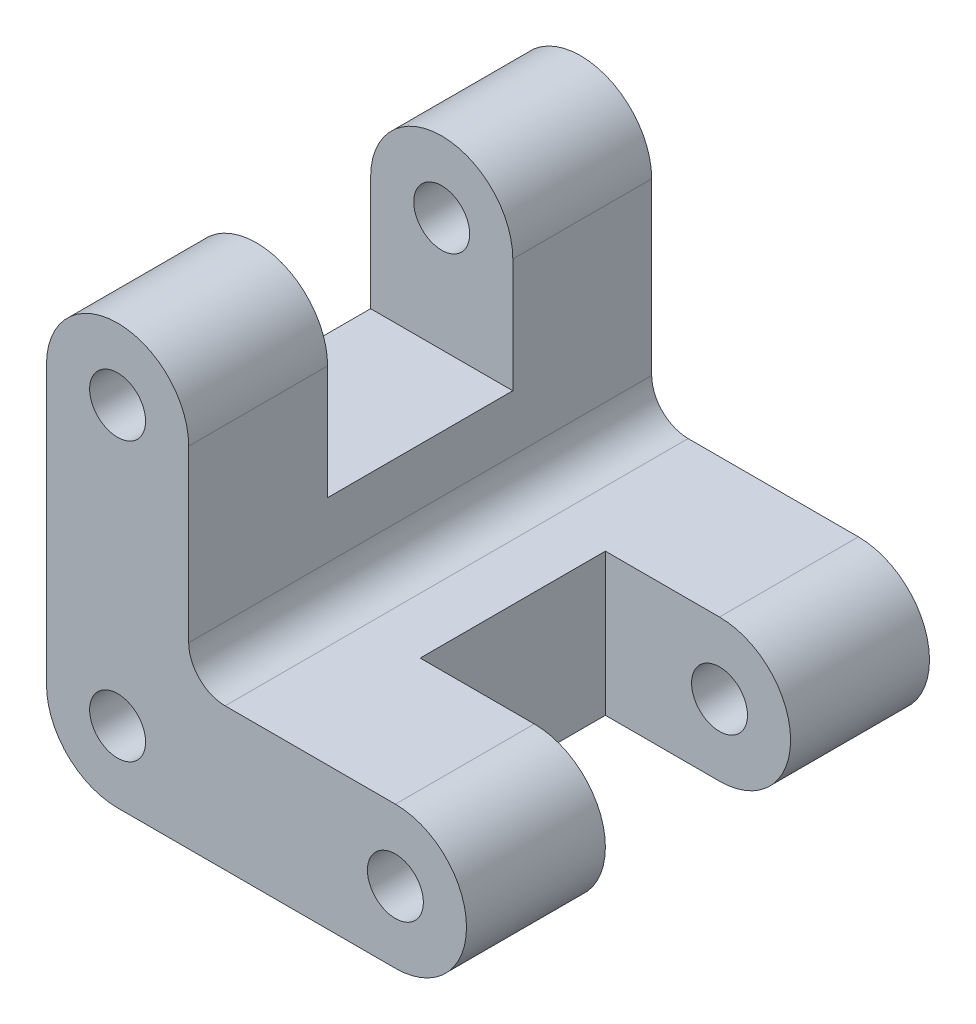
ISO-10303-21;
HEADER;
FILE_DESCRIPTION(('STEP AP214'),'2;1');
FILE_NAME('part.step','',(''),(''),'','','');
FILE_SCHEMA(('AUTOMOTIVE_DESIGN { 1 0 10303 214 1 1 1 1 }'));
ENDSEC;
DATA;
#1=APPLICATION_CONTEXT('core data for automotive mechanical design processes');
#2=APPLICATION_PROTOCOL_DEFINITION('international standard','automotive_design',2000,#1);
#3=PRODUCT_CONTEXT('',#1,'mechanical');
#4=PRODUCT('Part','Part','',(#3));
#5=PRODUCT_RELATED_PRODUCT_CATEGORY('part','',(#4));
#6=PRODUCT_DEFINITION_FORMATION('','',#4);
#7=PRODUCT_DEFINITION_CONTEXT('part definition',#1,'design');
#8=PRODUCT_DEFINITION('design','',#6,#7);
#9=PRODUCT_DEFINITION_SHAPE('','',#8);
#10=(LENGTH_UNIT() NAMED_UNIT(*) SI_UNIT(.MILLI.,.METRE.));
#11=(NAMED_UNIT(*) PLANE_ANGLE_UNIT() SI_UNIT($,.RADIAN.));
#12=(NAMED_UNIT(*) SI_UNIT($,.STERADIAN.) SOLID_ANGLE_UNIT());
#13=UNCERTAINTY_MEASURE_WITH_UNIT(LENGTH_MEASURE(1.E-05),#10,'distance_accuracy_value','');
#14=(GEOMETRIC_REPRESENTATION_CONTEXT(3) GLOBAL_UNCERTAINTY_ASSIGNED_CONTEXT((#13)) GLOBAL_UNIT_ASSIGNED_CONTEXT((#10,
#11,#12)) REPRESENTATION_CONTEXT('',''));
#15=CARTESIAN_POINT('',(0.,0.,0.));
#16=DIRECTION('',(0.,0.,1.));
#17=DIRECTION('',(1.,0.,0.));
#18=AXIS2_PLACEMENT_3D('',#15,#16,#17);
#19=CARTESIAN_POINT('',(0.,-19.5,127.));
#20=DIRECTION('',(0.,1.,0.));
#21=DIRECTION('',(-1.,0.,0.));
#22=AXIS2_PLACEMENT_3D('',#19,#20,#21);
#23=PLANE('',#22);
#24=DIRECTION('',(1.,0.,0.));
#25=VECTOR('',#24,1.);
#26=CARTESIAN_POINT('',(115.645219222053,-19.4999999999998,38.1));
#27=LINE('',#26,#25);
#28=CARTESIAN_POINT('',(44.9000000000002,-19.5000000000005,38.1));
#29=VERTEX_POINT('',#28);
#30=CARTESIAN_POINT('',(76.2000000000002,-19.5000000000002,38.1));
#31=VERTEX_POINT('',#30);
#32=EDGE_CURVE('E152',#29,#31,#27,.T.);
#33=ORIENTED_EDGE('',*,*,#32,.F.);
#34=DIRECTION('',(0.,0.,-1.));
#35=VECTOR('',#34,1.);
#36=CARTESIAN_POINT('',(44.9000000000002,-19.5000000000005,38.1));
#37=LINE('',#36,#35);
#38=CARTESIAN_POINT('',(44.9000000000002,-19.5000000000005,88.9));
#39=VERTEX_POINT('',#38);
#40=EDGE_CURVE('E144',#39,#29,#37,.T.);
#41=ORIENTED_EDGE('',*,*,#40,.F.);
#42=DIRECTION('',(-1.,0.,0.));
#43=VECTOR('',#42,1.);
#44=CARTESIAN_POINT('',(115.645219222053,-19.4999999999998,88.9));
#45=LINE('',#44,#43);
#46=CARTESIAN_POINT('',(76.2000000000002,-19.5000000000002,88.9));
#47=VERTEX_POINT('',#46);
#48=EDGE_CURVE('E151',#47,#39,#45,.T.);
#49=ORIENTED_EDGE('',*,*,#48,.F.);
#50=DIRECTION('',(0.,0.,-1.));
#51=VECTOR('',#50,1.);
#52=CARTESIAN_POINT('',(76.2,-19.5,127.));
#53=LINE('',#52,#51);
#54=CARTESIAN_POINT('',(76.2,-19.5,127.));
#55=VERTEX_POINT('',#54);
#56=EDGE_CURVE('E263',#55,#47,#53,.T.);
#57=ORIENTED_EDGE('',*,*,#56,.F.);
#58=DIRECTION('',(1.,0.,0.));
#59=VECTOR('',#58,1.);
#60=CARTESIAN_POINT('',(0.,-19.5,127.));
#61=LINE('',#60,#59);
#62=CARTESIAN_POINT('',(0.,-19.5,127.));
#63=VERTEX_POINT('',#62);
#64=EDGE_CURVE('E230',#63,#55,#61,.T.);
#65=ORIENTED_EDGE('',*,*,#64,.F.);
#66=DIRECTION('',(0.,0.,-1.));
#67=VECTOR('',#66,1.);
#68=CARTESIAN_POINT('',(0.,-19.5,127.));
#69=LINE('',#68,#67);
#70=CARTESIAN_POINT('',(0.,-19.5,0.));
#71=VERTEX_POINT('',#70);
#72=EDGE_CURVE('E266',#63,#71,#69,.T.);
#73=ORIENTED_EDGE('',*,*,#72,.T.);
#74=DIRECTION('',(1.,0.,0.));
#75=VECTOR('',#74,1.);
#76=CARTESIAN_POINT('',(0.,-19.5,0.));
#77=LINE('',#76,#75);
#78=CARTESIAN_POINT('',(76.2,-19.5,0.));
#79=VERTEX_POINT('',#78);
#80=EDGE_CURVE('E246',#71,#79,#77,.T.);
#81=ORIENTED_EDGE('',*,*,#80,.T.);
#82=EDGE_CURVE('E163',#31,#79,#53,.T.);
#83=ORIENTED_EDGE('',*,*,#82,.F.);
#84=EDGE_LOOP('',(#33,#41,#49,#57,#65,#73,#81,#83));
#85=FACE_BOUND('',#84,.T.);
#86=ADVANCED_FACE('F33',(#85),#23,.F.);
#87=CARTESIAN_POINT('',(76.2,0.,127.));
#88=DIRECTION('',(0.,0.,-1.));
#89=DIRECTION('',(-1.,0.,0.));
#90=AXIS2_PLACEMENT_3D('',#87,#88,#89);
#91=CYLINDRICAL_SURFACE('',#90,19.5);
#92=CARTESIAN_POINT('',(76.2,0.,38.1));
#93=DIRECTION('',(0.,0.,1.));
#94=DIRECTION('',(1.,0.,0.));
#95=AXIS2_PLACEMENT_3D('',#92,#93,#94);
#96=CIRCLE('',#95,19.5);
#97=CARTESIAN_POINT('',(76.2,19.5,38.1));
#98=VERTEX_POINT('',#97);
#99=EDGE_CURVE('E175',#31,#98,#96,.T.);
#100=ORIENTED_EDGE('',*,*,#99,.F.);
#101=ORIENTED_EDGE('',*,*,#82,.T.);
#102=CARTESIAN_POINT('',(76.2,0.,0.));
#103=DIRECTION('',(0.,0.,1.));
#104=DIRECTION('',(1.,0.,0.));
#105=AXIS2_PLACEMENT_3D('',#102,#103,#104);
#106=CIRCLE('',#105,19.5);
#107=CARTESIAN_POINT('',(76.2,19.5,0.));
#108=VERTEX_POINT('',#107);
#109=EDGE_CURVE('E248',#79,#108,#106,.T.);
#110=ORIENTED_EDGE('',*,*,#109,.T.);
#111=DIRECTION('',(0.,0.,-1.));
#112=VECTOR('',#111,1.);
#113=CARTESIAN_POINT('',(76.2,19.5,127.));
#114=LINE('',#113,#112);
#115=EDGE_CURVE('E259',#98,#108,#114,.T.);
#116=ORIENTED_EDGE('',*,*,#115,.F.);
#117=EDGE_LOOP('',(#100,#101,#110,#116));
#118=FACE_BOUND('',#117,.T.);
#119=ADVANCED_FACE('F310',(#118),#91,.T.);
#120=CARTESIAN_POINT('',(76.2,0.,88.9));
#121=DIRECTION('',(0.,0.,-1.));
#122=DIRECTION('',(-1.,0.,0.));
#123=AXIS2_PLACEMENT_3D('',#120,#121,#122);
#124=CIRCLE('',#123,19.5);
#125=CARTESIAN_POINT('',(76.2,19.5,88.9));
#126=VERTEX_POINT('',#125);
#127=EDGE_CURVE('E171',#126,#47,#124,.T.);
#128=ORIENTED_EDGE('',*,*,#127,.F.);
#129=CARTESIAN_POINT('',(76.2,19.5,127.));
#130=VERTEX_POINT('',#129);
#131=EDGE_CURVE('E260',#130,#126,#114,.T.);
#132=ORIENTED_EDGE('',*,*,#131,.F.);
#133=CARTESIAN_POINT('',(76.2,0.,127.));
#134=DIRECTION('',(0.,0.,1.));
#135=DIRECTION('',(1.,0.,0.));
#136=AXIS2_PLACEMENT_3D('',#133,#134,#135);
#137=CIRCLE('',#136,19.5);
#138=EDGE_CURVE('E232',#55,#130,#137,.T.);
#139=ORIENTED_EDGE('',*,*,#138,.F.);
#140=ORIENTED_EDGE('',*,*,#56,.T.);
#141=EDGE_LOOP('',(#128,#132,#139,#140));
#142=FACE_BOUND('',#141,.T.);
#143=ADVANCED_FACE('F316',(#142),#91,.T.);
#144=CARTESIAN_POINT('',(19.5,19.5,127.));
#145=DIRECTION('',(0.,-1.,0.));
#146=DIRECTION('',(1.,0.,0.));
#147=AXIS2_PLACEMENT_3D('',#144,#145,#146);
#148=PLANE('',#147);
#149=DIRECTION('',(-1.,0.,0.));
#150=VECTOR('',#149,1.);
#151=CARTESIAN_POINT('',(19.5,19.5,38.1));
#152=LINE('',#151,#150);
#153=CARTESIAN_POINT('',(44.8999999999998,19.5,38.1));
#154=VERTEX_POINT('',#153);
#155=EDGE_CURVE('E158',#98,#154,#152,.T.);
#156=ORIENTED_EDGE('',*,*,#155,.F.);
#157=ORIENTED_EDGE('',*,*,#115,.T.);
#158=DIRECTION('',(-1.,0.,0.));
#159=VECTOR('',#158,1.);
#160=CARTESIAN_POINT('',(19.5,19.5,0.));
#161=LINE('',#160,#159);
#162=CARTESIAN_POINT('',(29.5,19.5,0.));
#163=VERTEX_POINT('',#162);
#164=EDGE_CURVE('E251',#108,#163,#161,.T.);
#165=ORIENTED_EDGE('',*,*,#164,.T.);
#166=DIRECTION('',(0.,0.,-1.));
#167=VECTOR('',#166,1.);
#168=CARTESIAN_POINT('',(29.5,19.5,127.));
#169=LINE('',#168,#167);
#170=CARTESIAN_POINT('',(29.5,19.5,127.));
#171=VERTEX_POINT('',#170);
#172=EDGE_CURVE('E279',#163,#171,#169,.F.);
#173=ORIENTED_EDGE('',*,*,#172,.T.);
#174=DIRECTION('',(-1.,0.,0.));
#175=VECTOR('',#174,1.);
#176=CARTESIAN_POINT('',(19.5,19.5,127.));
#177=LINE('',#176,#175);
#178=EDGE_CURVE('E234',#130,#171,#177,.T.);
#179=ORIENTED_EDGE('',*,*,#178,.F.);
#180=ORIENTED_EDGE('',*,*,#131,.T.);
#181=DIRECTION('',(1.,0.,0.));
#182=VECTOR('',#181,1.);
#183=CARTESIAN_POINT('',(19.5,19.5,88.9));
#184=LINE('',#183,#182);
#185=CARTESIAN_POINT('',(44.8999999999998,19.5,88.9));
#186=VERTEX_POINT('',#185);
#187=EDGE_CURVE('E169',#186,#126,#184,.T.);
#188=ORIENTED_EDGE('',*,*,#187,.F.);
#189=DIRECTION('',(0.,0.,1.));
#190=VECTOR('',#189,1.);
#191=CARTESIAN_POINT('',(44.8999999999998,19.5,127.));
#192=LINE('',#191,#190);
#193=EDGE_CURVE('E11',#154,#186,#192,.T.);
#194=ORIENTED_EDGE('',*,*,#193,.F.);
#195=EDGE_LOOP('',(#156,#157,#165,#173,#179,#180,#188,#194));
#196=FACE_BOUND('',#195,.T.);
#197=ADVANCED_FACE('F389',(#196),#148,.F.);
#198=CARTESIAN_POINT('',(76.2,0.,127.));
#199=DIRECTION('',(0.,0.,-1.));
#200=DIRECTION('',(-1.,0.,0.));
#201=AXIS2_PLACEMENT_3D('',#198,#199,#200);
#202=CYLINDRICAL_SURFACE('',#201,7.67);
#203=CARTESIAN_POINT('',(76.2,0.,0.));
#204=DIRECTION('',(0.,0.,1.));
#205=DIRECTION('',(1.,0.,0.));
#206=AXIS2_PLACEMENT_3D('',#203,#204,#205);
#207=CIRCLE('',#206,7.67);
#208=CARTESIAN_POINT('',(83.87,0.,0.));
#209=VERTEX_POINT('',#208);
#210=EDGE_CURVE('E203',#209,#209,#207,.T.);
#211=ORIENTED_EDGE('',*,*,#210,.F.);
#212=EDGE_LOOP('',(#211));
#213=FACE_BOUND('',#212,.T.);
#214=CARTESIAN_POINT('',(76.2,0.,38.1));
#215=DIRECTION('',(0.,0.,1.));
#216=DIRECTION('',(1.,0.,0.));
#217=AXIS2_PLACEMENT_3D('',#214,#215,#216);
#218=CIRCLE('',#217,7.67);
#219=CARTESIAN_POINT('',(83.87,0.,38.1));
#220=VERTEX_POINT('',#219);
#221=EDGE_CURVE('E173',#220,#220,#218,.T.);
#222=ORIENTED_EDGE('',*,*,#221,.T.);
#223=EDGE_LOOP('',(#222));
#224=FACE_BOUND('',#223,.T.);
#225=ADVANCED_FACE('F295',(#213,#224),#202,.F.);
#226=CARTESIAN_POINT('',(76.2,0.,127.));
#227=DIRECTION('',(0.,0.,1.));
#228=DIRECTION('',(1.,0.,0.));
#229=AXIS2_PLACEMENT_3D('',#226,#227,#228);
#230=CIRCLE('',#229,7.67);
#231=CARTESIAN_POINT('',(83.87,0.,127.));
#232=VERTEX_POINT('',#231);
#233=EDGE_CURVE('E204',#232,#232,#230,.T.);
#234=ORIENTED_EDGE('',*,*,#233,.T.);
#235=EDGE_LOOP('',(#234));
#236=FACE_BOUND('',#235,.T.);
#237=CARTESIAN_POINT('',(76.2,0.,88.9));
#238=DIRECTION('',(0.,0.,-1.));
#239=DIRECTION('',(-1.,0.,0.));
#240=AXIS2_PLACEMENT_3D('',#237,#238,#239);
#241=CIRCLE('',#240,7.67);
#242=CARTESIAN_POINT('',(68.53,0.,88.9));
#243=VERTEX_POINT('',#242);
#244=EDGE_CURVE('E167',#243,#243,#241,.T.);
#245=ORIENTED_EDGE('',*,*,#244,.T.);
#246=EDGE_LOOP('',(#245));
#247=FACE_BOUND('',#246,.T.);
#248=ADVANCED_FACE('F343',(#236,#247),#202,.F.);
#249=CARTESIAN_POINT('',(0.,76.2,127.));
#250=DIRECTION('',(0.,0.,-1.));
#251=DIRECTION('',(-1.,0.,0.));
#252=AXIS2_PLACEMENT_3D('',#249,#250,#251);
#253=CYLINDRICAL_SURFACE('',#252,19.5);
#254=DIRECTION('',(0.,0.,-1.));
#255=VECTOR('',#254,1.);
#256=CARTESIAN_POINT('',(-19.5,76.2,127.));
#257=LINE('',#256,#255);
#258=CARTESIAN_POINT('',(-19.5,76.2,38.1));
#259=VERTEX_POINT('',#258);
#260=CARTESIAN_POINT('',(-19.5,76.2,0.));
#261=VERTEX_POINT('',#260);
#262=EDGE_CURVE('E272',#259,#261,#257,.T.);
#263=ORIENTED_EDGE('',*,*,#262,.F.);
#264=CARTESIAN_POINT('',(0.,76.2,38.1));
#265=DIRECTION('',(0.,0.,-1.));
#266=DIRECTION('',(0.,1.,0.));
#267=AXIS2_PLACEMENT_3D('',#264,#265,#266);
#268=CIRCLE('',#267,19.5);
#269=CARTESIAN_POINT('',(19.5,76.2,38.1));
#270=VERTEX_POINT('',#269);
#271=EDGE_CURVE('E200',#259,#270,#268,.T.);
#272=ORIENTED_EDGE('',*,*,#271,.T.);
#273=DIRECTION('',(0.,0.,-1.));
#274=VECTOR('',#273,1.);
#275=CARTESIAN_POINT('',(19.5,76.2,127.));
#276=LINE('',#275,#274);
#277=CARTESIAN_POINT('',(19.5,76.2,0.));
#278=VERTEX_POINT('',#277);
#279=EDGE_CURVE('E239',#270,#278,#276,.T.);
#280=ORIENTED_EDGE('',*,*,#279,.T.);
#281=CARTESIAN_POINT('',(0.,76.2,0.));
#282=DIRECTION('',(0.,0.,1.));
#283=DIRECTION('',(-1.,0.,0.));
#284=AXIS2_PLACEMENT_3D('',#281,#282,#283);
#285=CIRCLE('',#284,19.5);
#286=EDGE_CURVE('E219',#278,#261,#285,.T.);
#287=ORIENTED_EDGE('',*,*,#286,.T.);
#288=EDGE_LOOP('',(#263,#272,#280,#287));
#289=FACE_BOUND('',#288,.T.);
#290=ADVANCED_FACE('F333',(#289),#253,.T.);
#291=CARTESIAN_POINT('',(0.,76.2,127.));
#292=DIRECTION('',(0.,0.,-1.));
#293=DIRECTION('',(-1.,0.,0.));
#294=AXIS2_PLACEMENT_3D('',#291,#292,#293);
#295=CYLINDRICAL_SURFACE('',#294,7.67);
#296=CARTESIAN_POINT('',(0.,76.2,38.1));
#297=DIRECTION('',(0.,0.,-1.));
#298=DIRECTION('',(0.,1.,0.));
#299=AXIS2_PLACEMENT_3D('',#296,#297,#298);
#300=CIRCLE('',#299,7.67);
#301=CARTESIAN_POINT('',(0.,83.87,38.1));
#302=VERTEX_POINT('',#301);
#303=EDGE_CURVE('E196',#302,#302,#300,.T.);
#304=ORIENTED_EDGE('',*,*,#303,.F.);
#305=EDGE_LOOP('',(#304));
#306=FACE_BOUND('',#305,.T.);
#307=CARTESIAN_POINT('',(0.,76.2,0.));
#308=DIRECTION('',(0.,0.,1.));
#309=DIRECTION('',(1.,0.,0.));
#310=AXIS2_PLACEMENT_3D('',#307,#308,#309);
#311=CIRCLE('',#310,7.67);
#312=CARTESIAN_POINT('',(7.67,76.2,0.));
#313=VERTEX_POINT('',#312);
#314=EDGE_CURVE('E207',#313,#313,#311,.T.);
#315=ORIENTED_EDGE('',*,*,#314,.F.);
#316=EDGE_LOOP('',(#315));
#317=FACE_BOUND('',#316,.T.);
#318=ADVANCED_FACE('F342',(#306,#317),#295,.F.);
#319=CARTESIAN_POINT('',(0.,76.2,127.));
#320=DIRECTION('',(0.,0.,-1.));
#321=DIRECTION('',(-1.,0.,0.));
#322=AXIS2_PLACEMENT_3D('',#319,#320,#321);
#323=PLANE('',#322);
#324=CARTESIAN_POINT('',(0.,76.2,127.));
#325=DIRECTION('',(0.,0.,1.));
#326=DIRECTION('',(-1.,0.,0.));
#327=AXIS2_PLACEMENT_3D('',#324,#325,#326);
#328=CIRCLE('',#327,19.5);
#329=CARTESIAN_POINT('',(19.5,76.2,127.));
#330=VERTEX_POINT('',#329);
#331=CARTESIAN_POINT('',(-19.5,76.2,127.));
#332=VERTEX_POINT('',#331);
#333=EDGE_CURVE('E222',#330,#332,#328,.T.);
#334=ORIENTED_EDGE('',*,*,#333,.T.);
#335=DIRECTION('',(0.,-1.,0.));
#336=VECTOR('',#335,1.);
#337=CARTESIAN_POINT('',(-19.5,76.2,127.));
#338=LINE('',#337,#336);
#339=CARTESIAN_POINT('',(-19.5,0.,127.));
#340=VERTEX_POINT('',#339);
#341=EDGE_CURVE('E225',#332,#340,#338,.T.);
#342=ORIENTED_EDGE('',*,*,#341,.T.);
#343=CARTESIAN_POINT('',(0.,0.,127.));
#344=DIRECTION('',(0.,0.,1.));
#345=DIRECTION('',(1.,0.,0.));
#346=AXIS2_PLACEMENT_3D('',#343,#344,#345);
#347=CIRCLE('',#346,19.5);
#348=EDGE_CURVE('E228',#340,#63,#347,.T.);
#349=ORIENTED_EDGE('',*,*,#348,.T.);
#350=ORIENTED_EDGE('',*,*,#64,.T.);
#351=ORIENTED_EDGE('',*,*,#138,.T.);
#352=ORIENTED_EDGE('',*,*,#178,.T.);
#353=CARTESIAN_POINT('',(29.5,29.5,127.));
#354=DIRECTION('',(0.,0.,-1.));
#355=DIRECTION('',(-1.,0.,0.));
#356=AXIS2_PLACEMENT_3D('',#353,#354,#355);
#357=CIRCLE('',#356,10.);
#358=CARTESIAN_POINT('',(19.5,29.5,127.));
#359=VERTEX_POINT('',#358);
#360=EDGE_CURVE('E283',#171,#359,#357,.T.);
#361=ORIENTED_EDGE('',*,*,#360,.T.);
#362=DIRECTION('',(0.,1.,0.));
#363=VECTOR('',#362,1.);
#364=CARTESIAN_POINT('',(19.5,76.2,127.));
#365=LINE('',#364,#363);
#366=EDGE_CURVE('E237',#359,#330,#365,.T.);
#367=ORIENTED_EDGE('',*,*,#366,.T.);
#368=EDGE_LOOP('',(#334,#342,#349,#350,#351,#352,#361,#367));
#369=FACE_BOUND('',#368,.T.);
#370=CARTESIAN_POINT('',(0.,0.,127.));
#371=DIRECTION('',(0.,0.,1.));
#372=DIRECTION('',(1.,0.,0.));
#373=AXIS2_PLACEMENT_3D('',#370,#371,#372);
#374=CIRCLE('',#373,7.67);
#375=CARTESIAN_POINT('',(7.67,0.,127.));
#376=VERTEX_POINT('',#375);
#377=EDGE_CURVE('E216',#376,#376,#374,.T.);
#378=ORIENTED_EDGE('',*,*,#377,.F.);
#379=EDGE_LOOP('',(#378));
#380=FACE_BOUND('',#379,.T.);
#381=CARTESIAN_POINT('',(0.,76.2,127.));
#382=DIRECTION('',(0.,0.,1.));
#383=DIRECTION('',(1.,0.,0.));
#384=AXIS2_PLACEMENT_3D('',#381,#382,#383);
#385=CIRCLE('',#384,7.67);
#386=CARTESIAN_POINT('',(7.67,76.2,127.));
#387=VERTEX_POINT('',#386);
#388=EDGE_CURVE('E210',#387,#387,#385,.T.);
#389=ORIENTED_EDGE('',*,*,#388,.F.);
#390=EDGE_LOOP('',(#389));
#391=FACE_BOUND('',#390,.T.);
#392=ORIENTED_EDGE('',*,*,#233,.F.);
#393=EDGE_LOOP('',(#392));
#394=FACE_BOUND('',#393,.T.);
#395=ADVANCED_FACE('F338',(#369,#380,#391,#394),#323,.F.);
#396=CARTESIAN_POINT('',(0.,76.2,0.));
#397=DIRECTION('',(0.,0.,-1.));
#398=DIRECTION('',(-1.,0.,0.));
#399=AXIS2_PLACEMENT_3D('',#396,#397,#398);
#400=PLANE('',#399);
#401=ORIENTED_EDGE('',*,*,#314,.T.);
#402=EDGE_LOOP('',(#401));
#403=FACE_BOUND('',#402,.T.);
#404=ORIENTED_EDGE('',*,*,#286,.F.);
#405=DIRECTION('',(0.,1.,0.));
#406=VECTOR('',#405,1.);
#407=CARTESIAN_POINT('',(19.5,76.2,0.));
#408=LINE('',#407,#406);
#409=CARTESIAN_POINT('',(19.5,29.5,0.));
#410=VERTEX_POINT('',#409);
#411=EDGE_CURVE('E226',#410,#278,#408,.T.);
#412=ORIENTED_EDGE('',*,*,#411,.F.);
#413=CARTESIAN_POINT('',(29.5,29.5,0.));
#414=DIRECTION('',(0.,0.,-1.));
#415=DIRECTION('',(-1.,0.,0.));
#416=AXIS2_PLACEMENT_3D('',#413,#414,#415);
#417=CIRCLE('',#416,10.);
#418=EDGE_CURVE('E281',#410,#163,#417,.F.);
#419=ORIENTED_EDGE('',*,*,#418,.T.);
#420=ORIENTED_EDGE('',*,*,#164,.F.);
#421=ORIENTED_EDGE('',*,*,#109,.F.);
#422=ORIENTED_EDGE('',*,*,#80,.F.);
#423=CARTESIAN_POINT('',(0.,0.,0.));
#424=DIRECTION('',(0.,0.,1.));
#425=DIRECTION('',(1.,0.,0.));
#426=AXIS2_PLACEMENT_3D('',#423,#424,#425);
#427=CIRCLE('',#426,19.5);
#428=CARTESIAN_POINT('',(-19.5,0.,0.));
#429=VERTEX_POINT('',#428);
#430=EDGE_CURVE('E244',#429,#71,#427,.T.);
#431=ORIENTED_EDGE('',*,*,#430,.F.);
#432=DIRECTION('',(0.,-1.,0.));
#433=VECTOR('',#432,1.);
#434=CARTESIAN_POINT('',(-19.5,76.2,0.));
#435=LINE('',#434,#433);
#436=EDGE_CURVE('E242',#261,#429,#435,.T.);
#437=ORIENTED_EDGE('',*,*,#436,.F.);
#438=EDGE_LOOP('',(#404,#412,#419,#420,#421,#422,#431,#437));
#439=FACE_BOUND('',#438,.T.);
#440=CARTESIAN_POINT('',(0.,0.,0.));
#441=DIRECTION('',(0.,0.,1.));
#442=DIRECTION('',(1.,0.,0.));
#443=AXIS2_PLACEMENT_3D('',#440,#441,#442);
#444=CIRCLE('',#443,7.67);
#445=CARTESIAN_POINT('',(7.67,0.,0.));
#446=VERTEX_POINT('',#445);
#447=EDGE_CURVE('E213',#446,#446,#444,.T.);
#448=ORIENTED_EDGE('',*,*,#447,.T.);
#449=EDGE_LOOP('',(#448));
#450=FACE_BOUND('',#449,.T.);
#451=ORIENTED_EDGE('',*,*,#210,.T.);
#452=EDGE_LOOP('',(#451));
#453=FACE_BOUND('',#452,.T.);
#454=ADVANCED_FACE('F331',(#403,#439,#450,#453),#400,.T.);
#455=CARTESIAN_POINT('',(19.5,76.2,88.9));
#456=VERTEX_POINT('',#455);
#457=EDGE_CURVE('E256',#330,#456,#276,.T.);
#458=ORIENTED_EDGE('',*,*,#457,.T.);
#459=CARTESIAN_POINT('',(0.,76.2,88.9));
#460=DIRECTION('',(0.,0.,1.));
#461=DIRECTION('',(1.,0.,0.));
#462=AXIS2_PLACEMENT_3D('',#459,#460,#461);
#463=CIRCLE('',#462,19.5);
#464=CARTESIAN_POINT('',(-19.5,76.2,88.9));
#465=VERTEX_POINT('',#464);
#466=EDGE_CURVE('E55',#456,#465,#463,.T.);
#467=ORIENTED_EDGE('',*,*,#466,.T.);
#468=EDGE_CURVE('E273',#332,#465,#257,.T.);
#469=ORIENTED_EDGE('',*,*,#468,.F.);
#470=ORIENTED_EDGE('',*,*,#333,.F.);
#471=EDGE_LOOP('',(#458,#467,#469,#470));
#472=FACE_BOUND('',#471,.T.);
#473=ADVANCED_FACE('F328',(#472),#253,.T.);
#474=CARTESIAN_POINT('',(-19.5,76.2,127.));
#475=DIRECTION('',(1.,0.,0.));
#476=DIRECTION('',(0.,1.,0.));
#477=AXIS2_PLACEMENT_3D('',#474,#475,#476);
#478=PLANE('',#477);
#479=DIRECTION('',(0.,0.,-1.));
#480=VECTOR('',#479,1.);
#481=CARTESIAN_POINT('',(-19.5,44.9,38.1));
#482=LINE('',#481,#480);
#483=CARTESIAN_POINT('',(-19.5,44.9,88.9));
#484=VERTEX_POINT('',#483);
#485=CARTESIAN_POINT('',(-19.5,44.9,38.1));
#486=VERTEX_POINT('',#485);
#487=EDGE_CURVE('E183',#484,#486,#482,.T.);
#488=ORIENTED_EDGE('',*,*,#487,.T.);
#489=DIRECTION('',(0.,1.,0.));
#490=VECTOR('',#489,1.);
#491=CARTESIAN_POINT('',(-19.5,115.645219222053,38.1));
#492=LINE('',#491,#490);
#493=EDGE_CURVE('E177',#486,#259,#492,.T.);
#494=ORIENTED_EDGE('',*,*,#493,.T.);
#495=ORIENTED_EDGE('',*,*,#262,.T.);
#496=ORIENTED_EDGE('',*,*,#436,.T.);
#497=DIRECTION('',(0.,0.,-1.));
#498=VECTOR('',#497,1.);
#499=CARTESIAN_POINT('',(-19.5,0.,127.));
#500=LINE('',#499,#498);
#501=EDGE_CURVE('E269',#340,#429,#500,.T.);
#502=ORIENTED_EDGE('',*,*,#501,.F.);
#503=ORIENTED_EDGE('',*,*,#341,.F.);
#504=ORIENTED_EDGE('',*,*,#468,.T.);
#505=DIRECTION('',(0.,-1.,0.));
#506=VECTOR('',#505,1.);
#507=CARTESIAN_POINT('',(-19.5,115.645219222053,88.9));
#508=LINE('',#507,#506);
#509=EDGE_CURVE('E180',#465,#484,#508,.T.);
#510=ORIENTED_EDGE('',*,*,#509,.T.);
#511=EDGE_LOOP('',(#488,#494,#495,#496,#502,#503,#504,#510));
#512=FACE_BOUND('',#511,.T.);
#513=ADVANCED_FACE('F325',(#512),#478,.F.);
#514=CARTESIAN_POINT('',(0.,0.,127.));
#515=DIRECTION('',(0.,0.,-1.));
#516=DIRECTION('',(-1.,0.,0.));
#517=AXIS2_PLACEMENT_3D('',#514,#515,#516);
#518=CYLINDRICAL_SURFACE('',#517,19.5);
#519=ORIENTED_EDGE('',*,*,#430,.T.);
#520=ORIENTED_EDGE('',*,*,#72,.F.);
#521=ORIENTED_EDGE('',*,*,#348,.F.);
#522=ORIENTED_EDGE('',*,*,#501,.T.);
#523=EDGE_LOOP('',(#519,#520,#521,#522));
#524=FACE_BOUND('',#523,.T.);
#525=ADVANCED_FACE('F321',(#524),#518,.T.);
#526=CARTESIAN_POINT('',(19.5,76.2,127.));
#527=DIRECTION('',(-1.,0.,0.));
#528=DIRECTION('',(0.,0.,1.));
#529=AXIS2_PLACEMENT_3D('',#526,#527,#528);
#530=PLANE('',#529);
#531=ORIENTED_EDGE('',*,*,#279,.F.);
#532=DIRECTION('',(0.,-1.,0.));
#533=VECTOR('',#532,1.);
#534=CARTESIAN_POINT('',(19.5,76.2,38.1));
#535=LINE('',#534,#533);
#536=CARTESIAN_POINT('',(19.5,44.9,38.1));
#537=VERTEX_POINT('',#536);
#538=EDGE_CURVE('E197',#270,#537,#535,.T.);
#539=ORIENTED_EDGE('',*,*,#538,.T.);
#540=DIRECTION('',(0.,0.,1.));
#541=VECTOR('',#540,1.);
#542=CARTESIAN_POINT('',(19.5,44.9,127.));
#543=LINE('',#542,#541);
#544=CARTESIAN_POINT('',(19.5,44.9,88.9));
#545=VERTEX_POINT('',#544);
#546=EDGE_CURVE('E41',#537,#545,#543,.T.);
#547=ORIENTED_EDGE('',*,*,#546,.T.);
#548=DIRECTION('',(0.,1.,0.));
#549=VECTOR('',#548,1.);
#550=CARTESIAN_POINT('',(19.5,76.2,88.9));
#551=LINE('',#550,#549);
#552=EDGE_CURVE('E193',#545,#456,#551,.T.);
#553=ORIENTED_EDGE('',*,*,#552,.T.);
#554=ORIENTED_EDGE('',*,*,#457,.F.);
#555=ORIENTED_EDGE('',*,*,#366,.F.);
#556=DIRECTION('',(0.,0.,-1.));
#557=VECTOR('',#556,1.);
#558=CARTESIAN_POINT('',(19.5,29.5,0.));
#559=LINE('',#558,#557);
#560=EDGE_CURVE('E276',#359,#410,#559,.T.);
#561=ORIENTED_EDGE('',*,*,#560,.T.);
#562=ORIENTED_EDGE('',*,*,#411,.T.);
#563=EDGE_LOOP('',(#531,#539,#547,#553,#554,#555,#561,#562));
#564=FACE_BOUND('',#563,.T.);
#565=ADVANCED_FACE('F324',(#564),#530,.F.);
#566=CARTESIAN_POINT('',(0.,0.,127.));
#567=DIRECTION('',(0.,0.,-1.));
#568=DIRECTION('',(-1.,0.,0.));
#569=AXIS2_PLACEMENT_3D('',#566,#567,#568);
#570=CYLINDRICAL_SURFACE('',#569,7.67);
#571=ORIENTED_EDGE('',*,*,#377,.T.);
#572=EDGE_LOOP('',(#571));
#573=FACE_BOUND('',#572,.T.);
#574=ORIENTED_EDGE('',*,*,#447,.F.);
#575=EDGE_LOOP('',(#574));
#576=FACE_BOUND('',#575,.T.);
#577=ADVANCED_FACE('F407',(#573,#576),#570,.F.);
#578=CARTESIAN_POINT('',(0.,76.2,88.9));
#579=DIRECTION('',(0.,0.,1.));
#580=DIRECTION('',(1.,0.,0.));
#581=AXIS2_PLACEMENT_3D('',#578,#579,#580);
#582=CIRCLE('',#581,7.67);
#583=CARTESIAN_POINT('',(7.67,76.2,88.9));
#584=VERTEX_POINT('',#583);
#585=EDGE_CURVE('E190',#584,#584,#582,.T.);
#586=ORIENTED_EDGE('',*,*,#585,.F.);
#587=EDGE_LOOP('',(#586));
#588=FACE_BOUND('',#587,.T.);
#589=ORIENTED_EDGE('',*,*,#388,.T.);
#590=EDGE_LOOP('',(#589));
#591=FACE_BOUND('',#590,.T.);
#592=ADVANCED_FACE('F350',(#588,#591),#295,.F.);
#593=CARTESIAN_POINT('',(29.5,29.5,127.));
#594=DIRECTION('',(0.,0.,1.));
#595=DIRECTION('',(1.,0.,0.));
#596=AXIS2_PLACEMENT_3D('',#593,#594,#595);
#597=CYLINDRICAL_SURFACE('',#596,10.);
#598=ORIENTED_EDGE('',*,*,#360,.F.);
#599=ORIENTED_EDGE('',*,*,#172,.F.);
#600=ORIENTED_EDGE('',*,*,#418,.F.);
#601=ORIENTED_EDGE('',*,*,#560,.F.);
#602=EDGE_LOOP('',(#598,#599,#600,#601));
#603=FACE_BOUND('',#602,.T.);
#604=ADVANCED_FACE('F35',(#603),#597,.F.);
#605=CARTESIAN_POINT('',(-19.5,44.9,38.1));
#606=DIRECTION('',(0.,-1.,0.));
#607=DIRECTION('',(0.,0.,-1.));
#608=AXIS2_PLACEMENT_3D('',#605,#606,#607);
#609=PLANE('',#608);
#610=DIRECTION('',(1.,0.,0.));
#611=VECTOR('',#610,1.);
#612=CARTESIAN_POINT('',(-19.5,44.9,38.1));
#613=LINE('',#612,#611);
#614=EDGE_CURVE('E187',#486,#537,#613,.T.);
#615=ORIENTED_EDGE('',*,*,#614,.F.);
#616=ORIENTED_EDGE('',*,*,#487,.F.);
#617=DIRECTION('',(1.,0.,0.));
#618=VECTOR('',#617,1.);
#619=CARTESIAN_POINT('',(-19.5,44.9,88.9));
#620=LINE('',#619,#618);
#621=EDGE_CURVE('E186',#484,#545,#620,.T.);
#622=ORIENTED_EDGE('',*,*,#621,.T.);
#623=ORIENTED_EDGE('',*,*,#546,.F.);
#624=EDGE_LOOP('',(#615,#616,#622,#623));
#625=FACE_BOUND('',#624,.T.);
#626=ADVANCED_FACE('F382',(#625),#609,.F.);
#627=CARTESIAN_POINT('',(-19.5,115.645219222053,38.1));
#628=DIRECTION('',(0.,0.,-1.));
#629=DIRECTION('',(0.,1.,0.));
#630=AXIS2_PLACEMENT_3D('',#627,#628,#629);
#631=PLANE('',#630);
#632=ORIENTED_EDGE('',*,*,#303,.T.);
#633=EDGE_LOOP('',(#632));
#634=FACE_BOUND('',#633,.T.);
#635=ORIENTED_EDGE('',*,*,#493,.F.);
#636=ORIENTED_EDGE('',*,*,#614,.T.);
#637=ORIENTED_EDGE('',*,*,#538,.F.);
#638=ORIENTED_EDGE('',*,*,#271,.F.);
#639=EDGE_LOOP('',(#635,#636,#637,#638));
#640=FACE_BOUND('',#639,.T.);
#641=ADVANCED_FACE('F384',(#634,#640),#631,.F.);
#642=CARTESIAN_POINT('',(-19.5,115.645219222053,88.9));
#643=DIRECTION('',(0.,0.,1.));
#644=DIRECTION('',(1.,0.,0.));
#645=AXIS2_PLACEMENT_3D('',#642,#643,#644);
#646=PLANE('',#645);
#647=ORIENTED_EDGE('',*,*,#585,.T.);
#648=EDGE_LOOP('',(#647));
#649=FACE_BOUND('',#648,.T.);
#650=ORIENTED_EDGE('',*,*,#552,.F.);
#651=ORIENTED_EDGE('',*,*,#621,.F.);
#652=ORIENTED_EDGE('',*,*,#509,.F.);
#653=ORIENTED_EDGE('',*,*,#466,.F.);
#654=EDGE_LOOP('',(#650,#651,#652,#653));
#655=FACE_BOUND('',#654,.T.);
#656=ADVANCED_FACE('F306',(#649,#655),#646,.F.);
#657=CARTESIAN_POINT('',(44.9000000000002,-19.5000000000005,38.1));
#658=DIRECTION('',(1.,0.,0.));
#659=DIRECTION('',(0.,1.,0.));
#660=AXIS2_PLACEMENT_3D('',#657,#658,#659);
#661=PLANE('',#660);
#662=ORIENTED_EDGE('',*,*,#193,.T.);
#663=DIRECTION('',(0.,1.,0.));
#664=VECTOR('',#663,1.);
#665=CARTESIAN_POINT('',(44.9000000000002,-19.5000000000005,88.9));
#666=LINE('',#665,#664);
#667=EDGE_CURVE('E147',#39,#186,#666,.T.);
#668=ORIENTED_EDGE('',*,*,#667,.F.);
#669=ORIENTED_EDGE('',*,*,#40,.T.);
#670=DIRECTION('',(0.,1.,0.));
#671=VECTOR('',#670,1.);
#672=CARTESIAN_POINT('',(44.9000000000002,-19.5000000000005,38.1));
#673=LINE('',#672,#671);
#674=EDGE_CURVE('E47',#29,#154,#673,.T.);
#675=ORIENTED_EDGE('',*,*,#674,.T.);
#676=EDGE_LOOP('',(#662,#668,#669,#675));
#677=FACE_BOUND('',#676,.T.);
#678=ADVANCED_FACE('F145',(#677),#661,.T.);
#679=CARTESIAN_POINT('',(115.645219222053,-19.4999999999998,38.1));
#680=DIRECTION('',(0.,0.,1.));
#681=DIRECTION('',(1.,0.,0.));
#682=AXIS2_PLACEMENT_3D('',#679,#680,#681);
#683=PLANE('',#682);
#684=ORIENTED_EDGE('',*,*,#221,.F.);
#685=EDGE_LOOP('',(#684));
#686=FACE_BOUND('',#685,.T.);
#687=ORIENTED_EDGE('',*,*,#99,.T.);
#688=ORIENTED_EDGE('',*,*,#155,.T.);
#689=ORIENTED_EDGE('',*,*,#674,.F.);
#690=ORIENTED_EDGE('',*,*,#32,.T.);
#691=EDGE_LOOP('',(#687,#688,#689,#690));
#692=FACE_BOUND('',#691,.T.);
#693=ADVANCED_FACE('F155',(#686,#692),#683,.T.);
#694=CARTESIAN_POINT('',(115.645219222053,-19.4999999999998,88.9));
#695=DIRECTION('',(0.,0.,-1.));
#696=DIRECTION('',(-1.,0.,0.));
#697=AXIS2_PLACEMENT_3D('',#694,#695,#696);
#698=PLANE('',#697);
#699=ORIENTED_EDGE('',*,*,#244,.F.);
#700=EDGE_LOOP('',(#699));
#701=FACE_BOUND('',#700,.T.);
#702=ORIENTED_EDGE('',*,*,#127,.T.);
#703=ORIENTED_EDGE('',*,*,#48,.T.);
#704=ORIENTED_EDGE('',*,*,#667,.T.);
#705=ORIENTED_EDGE('',*,*,#187,.T.);
#706=EDGE_LOOP('',(#702,#703,#704,#705));
#707=FACE_BOUND('',#706,.T.);
#708=ADVANCED_FACE('F298',(#701,#707),#698,.T.);
#709=CLOSED_SHELL('',(#86,#119,#143,#197,#225,#248,#290,#318,#395,#454,#473,#513,#525,#565,#577,
#592,#604,#626,#641,#656,#678,#693,#708));
#710=MANIFOLD_SOLID_BREP('B2',#709);
#711=ADVANCED_BREP_SHAPE_REPRESENTATION('',(#18,#710),#14);
#712=SHAPE_DEFINITION_REPRESENTATION(#9,#711);
ENDSEC;
END-ISO-10303-21;
